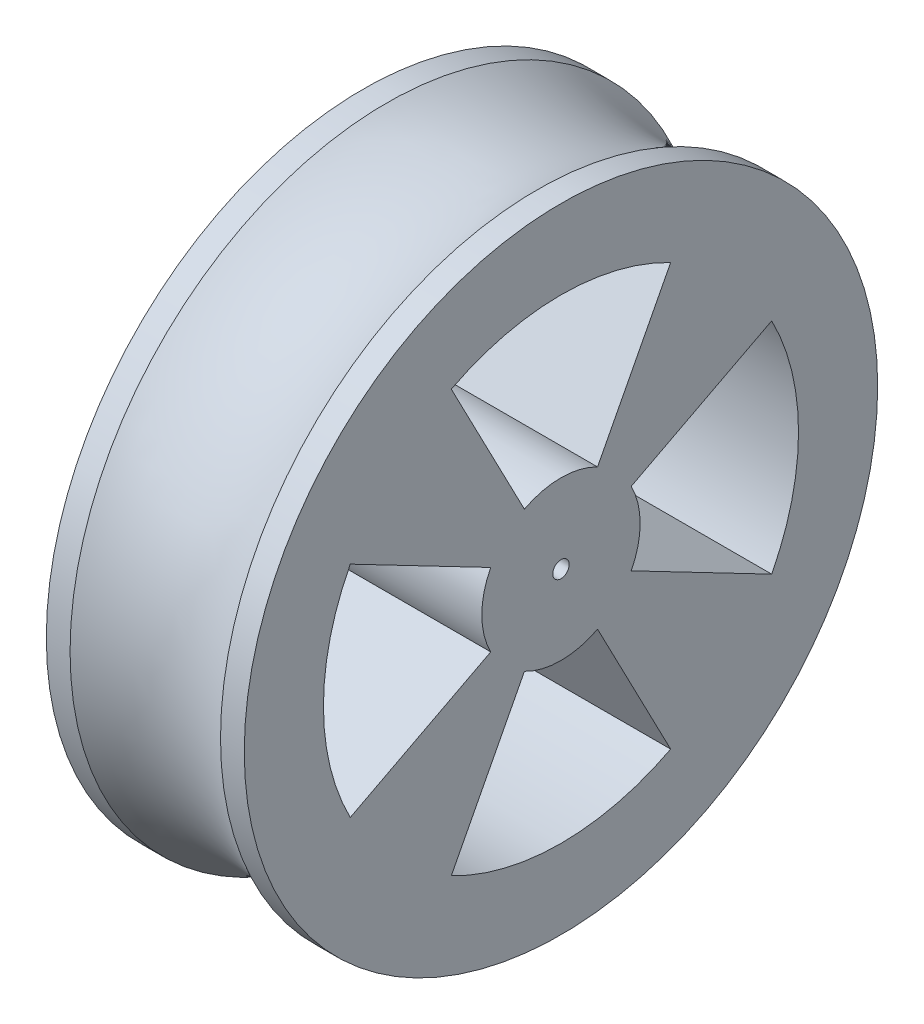
ISO-10303-21;
HEADER;
FILE_DESCRIPTION(('STEP AP214'),'2;1');
FILE_NAME('part.step','',(''),(''),'','','');
FILE_SCHEMA(('AUTOMOTIVE_DESIGN { 1 0 10303 214 1 1 1 1 }'));
ENDSEC;
DATA;
#1=APPLICATION_CONTEXT('core data for automotive mechanical design processes');
#2=APPLICATION_PROTOCOL_DEFINITION('international standard','automotive_design',2000,#1);
#3=PRODUCT_CONTEXT('',#1,'mechanical');
#4=PRODUCT('Part','Part','',(#3));
#5=PRODUCT_RELATED_PRODUCT_CATEGORY('part','',(#4));
#6=PRODUCT_DEFINITION_FORMATION('','',#4);
#7=PRODUCT_DEFINITION_CONTEXT('part definition',#1,'design');
#8=PRODUCT_DEFINITION('design','',#6,#7);
#9=PRODUCT_DEFINITION_SHAPE('','',#8);
#10=(LENGTH_UNIT() NAMED_UNIT(*) SI_UNIT(.MILLI.,.METRE.));
#11=(NAMED_UNIT(*) PLANE_ANGLE_UNIT() SI_UNIT($,.RADIAN.));
#12=(NAMED_UNIT(*) SI_UNIT($,.STERADIAN.) SOLID_ANGLE_UNIT());
#13=UNCERTAINTY_MEASURE_WITH_UNIT(LENGTH_MEASURE(1.E-05),#10,'distance_accuracy_value','');
#14=(GEOMETRIC_REPRESENTATION_CONTEXT(3) GLOBAL_UNCERTAINTY_ASSIGNED_CONTEXT((#13)) GLOBAL_UNIT_ASSIGNED_CONTEXT((#10,
#11,#12)) REPRESENTATION_CONTEXT('',''));
#15=CARTESIAN_POINT('',(0.,0.,0.));
#16=DIRECTION('',(0.,0.,1.));
#17=DIRECTION('',(1.,0.,0.));
#18=AXIS2_PLACEMENT_3D('',#15,#16,#17);
#19=CARTESIAN_POINT('',(12.5,0.,-40.));
#20=DIRECTION('',(-1.,0.,0.));
#21=DIRECTION('',(0.,0.,1.));
#22=AXIS2_PLACEMENT_3D('',#19,#20,#21);
#23=PLANE('',#22);
#24=CARTESIAN_POINT('',(12.5,0.,0.));
#25=DIRECTION('',(1.,0.,0.));
#26=DIRECTION('',(0.,0.,-1.));
#27=AXIS2_PLACEMENT_3D('',#24,#25,#26);
#28=CIRCLE('',#27,1.04);
#29=CARTESIAN_POINT('',(12.5,0.,-1.04));
#30=VERTEX_POINT('',#29);
#31=EDGE_CURVE('E165',#30,#30,#28,.T.);
#32=ORIENTED_EDGE('',*,*,#31,.F.);
#33=EDGE_LOOP('',(#32));
#34=FACE_BOUND('',#33,.T.);
#35=DIRECTION('',(0.,-0.887010833178223,0.461748613235032));
#36=VECTOR('',#35,1.);
#37=CARTESIAN_POINT('',(12.5,-26.6103249953467,13.8524583970509));
#38=LINE('',#37,#36);
#39=CARTESIAN_POINT('',(12.5,-8.87010833178223,4.61748613235032));
#40=VERTEX_POINT('',#39);
#41=CARTESIAN_POINT('',(12.5,-26.6103249953467,13.852458397051));
#42=VERTEX_POINT('',#41);
#43=EDGE_CURVE('E234',#40,#42,#38,.T.);
#44=ORIENTED_EDGE('',*,*,#43,.F.);
#45=CARTESIAN_POINT('',(12.5,0.,0.));
#46=DIRECTION('',(-1.,0.,0.));
#47=DIRECTION('',(0.,0.,-1.));
#48=AXIS2_PLACEMENT_3D('',#45,#46,#47);
#49=CIRCLE('',#48,10.);
#50=CARTESIAN_POINT('',(12.5,-8.87010833178223,-4.61748613235032));
#51=VERTEX_POINT('',#50);
#52=EDGE_CURVE('E54',#51,#40,#49,.T.);
#53=ORIENTED_EDGE('',*,*,#52,.F.);
#54=DIRECTION('',(0.,0.887010833178222,0.461748613235033));
#55=VECTOR('',#54,1.);
#56=CARTESIAN_POINT('',(12.5,-8.87010833178223,-4.61748613235032));
#57=LINE('',#56,#55);
#58=CARTESIAN_POINT('',(12.5,-26.6103249953467,-13.852458397051));
#59=VERTEX_POINT('',#58);
#60=EDGE_CURVE('E219',#59,#51,#57,.T.);
#61=ORIENTED_EDGE('',*,*,#60,.F.);
#62=CARTESIAN_POINT('',(12.5,0.,0.));
#63=DIRECTION('',(1.,0.,0.));
#64=DIRECTION('',(0.,0.,-1.));
#65=AXIS2_PLACEMENT_3D('',#62,#63,#64);
#66=CIRCLE('',#65,30.);
#67=EDGE_CURVE('E238',#42,#59,#66,.T.);
#68=ORIENTED_EDGE('',*,*,#67,.F.);
#69=EDGE_LOOP('',(#44,#53,#61,#68));
#70=FACE_BOUND('',#69,.T.);
#71=DIRECTION('',(0.,-0.461748613235032,-0.887010833178223));
#72=VECTOR('',#71,1.);
#73=CARTESIAN_POINT('',(12.5,-13.8524583970509,-26.6103249953467));
#74=LINE('',#73,#72);
#75=CARTESIAN_POINT('',(12.5,-4.61748613235031,-8.87010833178223));
#76=VERTEX_POINT('',#75);
#77=CARTESIAN_POINT('',(12.5,-13.852458397051,-26.6103249953467));
#78=VERTEX_POINT('',#77);
#79=EDGE_CURVE('E276',#76,#78,#74,.T.);
#80=ORIENTED_EDGE('',*,*,#79,.F.);
#81=CARTESIAN_POINT('',(12.5,0.,0.));
#82=DIRECTION('',(-1.,0.,0.));
#83=DIRECTION('',(0.,0.,-1.));
#84=AXIS2_PLACEMENT_3D('',#81,#82,#83);
#85=CIRCLE('',#84,10.);
#86=CARTESIAN_POINT('',(12.5,4.61748613235032,-8.87010833178223));
#87=VERTEX_POINT('',#86);
#88=EDGE_CURVE('E62',#87,#76,#85,.T.);
#89=ORIENTED_EDGE('',*,*,#88,.F.);
#90=DIRECTION('',(0.,-0.461748613235032,0.887010833178223));
#91=VECTOR('',#90,1.);
#92=CARTESIAN_POINT('',(12.5,4.61748613235032,-8.87010833178223));
#93=LINE('',#92,#91);
#94=CARTESIAN_POINT('',(12.5,13.852458397051,-26.6103249953467));
#95=VERTEX_POINT('',#94);
#96=EDGE_CURVE('E261',#95,#87,#93,.T.);
#97=ORIENTED_EDGE('',*,*,#96,.F.);
#98=CARTESIAN_POINT('',(12.5,0.,0.));
#99=DIRECTION('',(1.,0.,0.));
#100=DIRECTION('',(0.,0.,-1.));
#101=AXIS2_PLACEMENT_3D('',#98,#99,#100);
#102=CIRCLE('',#101,30.);
#103=EDGE_CURVE('E280',#78,#95,#102,.T.);
#104=ORIENTED_EDGE('',*,*,#103,.F.);
#105=EDGE_LOOP('',(#80,#89,#97,#104));
#106=FACE_BOUND('',#105,.T.);
#107=DIRECTION('',(0.,0.461748613235032,0.887010833178223));
#108=VECTOR('',#107,1.);
#109=CARTESIAN_POINT('',(12.5,13.8524583970509,26.6103249953467));
#110=LINE('',#109,#108);
#111=CARTESIAN_POINT('',(12.5,4.61748613235032,8.87010833178222));
#112=VERTEX_POINT('',#111);
#113=CARTESIAN_POINT('',(12.5,13.8524583970509,26.6103249953467));
#114=VERTEX_POINT('',#113);
#115=EDGE_CURVE('E169',#112,#114,#110,.T.);
#116=ORIENTED_EDGE('',*,*,#115,.F.);
#117=CARTESIAN_POINT('',(12.5,0.,0.));
#118=DIRECTION('',(-1.,0.,0.));
#119=DIRECTION('',(0.,0.,-1.));
#120=AXIS2_PLACEMENT_3D('',#117,#118,#119);
#121=CIRCLE('',#120,10.);
#122=CARTESIAN_POINT('',(12.5,-4.61748613235032,8.87010833178222));
#123=VERTEX_POINT('',#122);
#124=EDGE_CURVE('E164',#123,#112,#121,.T.);
#125=ORIENTED_EDGE('',*,*,#124,.F.);
#126=DIRECTION('',(0.,0.461748613235032,-0.887010833178223));
#127=VECTOR('',#126,1.);
#128=CARTESIAN_POINT('',(12.5,-4.61748613235032,8.87010833178222));
#129=LINE('',#128,#127);
#130=CARTESIAN_POINT('',(12.5,-13.852458397051,26.6103249953467));
#131=VERTEX_POINT('',#130);
#132=EDGE_CURVE('E179',#131,#123,#129,.T.);
#133=ORIENTED_EDGE('',*,*,#132,.F.);
#134=CARTESIAN_POINT('',(12.5,0.,0.));
#135=DIRECTION('',(1.,0.,0.));
#136=DIRECTION('',(0.,0.,-1.));
#137=AXIS2_PLACEMENT_3D('',#134,#135,#136);
#138=CIRCLE('',#137,30.);
#139=EDGE_CURVE('E195',#114,#131,#138,.T.);
#140=ORIENTED_EDGE('',*,*,#139,.F.);
#141=EDGE_LOOP('',(#116,#125,#133,#140));
#142=FACE_BOUND('',#141,.T.);
#143=DIRECTION('',(0.,0.887010833178223,-0.461748613235032));
#144=VECTOR('',#143,1.);
#145=CARTESIAN_POINT('',(12.5,26.6103249953467,-13.852458397051));
#146=LINE('',#145,#144);
#147=CARTESIAN_POINT('',(12.5,8.87010833178223,-4.61748613235032));
#148=VERTEX_POINT('',#147);
#149=CARTESIAN_POINT('',(12.5,26.6103249953467,-13.852458397051));
#150=VERTEX_POINT('',#149);
#151=EDGE_CURVE('E319',#148,#150,#146,.T.);
#152=ORIENTED_EDGE('',*,*,#151,.F.);
#153=CARTESIAN_POINT('',(12.5,0.,0.));
#154=DIRECTION('',(-1.,0.,0.));
#155=DIRECTION('',(0.,0.,-1.));
#156=AXIS2_PLACEMENT_3D('',#153,#154,#155);
#157=CIRCLE('',#156,10.);
#158=CARTESIAN_POINT('',(12.5,8.87010833178223,4.61748613235031));
#159=VERTEX_POINT('',#158);
#160=EDGE_CURVE('E290',#159,#148,#157,.T.);
#161=ORIENTED_EDGE('',*,*,#160,.F.);
#162=DIRECTION('',(0.,-0.887010833178223,-0.461748613235032));
#163=VECTOR('',#162,1.);
#164=CARTESIAN_POINT('',(12.5,8.87010833178223,4.61748613235031));
#165=LINE('',#164,#163);
#166=CARTESIAN_POINT('',(12.5,26.6103249953467,13.8524583970509));
#167=VERTEX_POINT('',#166);
#168=EDGE_CURVE('E304',#167,#159,#165,.T.);
#169=ORIENTED_EDGE('',*,*,#168,.F.);
#170=CARTESIAN_POINT('',(12.5,0.,0.));
#171=DIRECTION('',(1.,0.,0.));
#172=DIRECTION('',(0.,0.,-1.));
#173=AXIS2_PLACEMENT_3D('',#170,#171,#172);
#174=CIRCLE('',#173,30.);
#175=EDGE_CURVE('E323',#150,#167,#174,.T.);
#176=ORIENTED_EDGE('',*,*,#175,.F.);
#177=EDGE_LOOP('',(#152,#161,#169,#176));
#178=FACE_BOUND('',#177,.T.);
#179=CARTESIAN_POINT('',(12.5,0.,0.));
#180=DIRECTION('',(-1.,0.,0.));
#181=DIRECTION('',(0.,0.,1.));
#182=AXIS2_PLACEMENT_3D('',#179,#180,#181);
#183=CIRCLE('',#182,40.);
#184=CARTESIAN_POINT('',(12.5,0.,40.));
#185=VERTEX_POINT('',#184);
#186=EDGE_CURVE('E11',#185,#185,#183,.T.);
#187=ORIENTED_EDGE('',*,*,#186,.F.);
#188=EDGE_LOOP('',(#187));
#189=FACE_BOUND('',#188,.T.);
#190=ADVANCED_FACE('F39',(#34,#70,#106,#142,#178,#189),#23,.F.);
#191=CARTESIAN_POINT('',(-12.5,0.,0.));
#192=DIRECTION('',(-1.,0.,0.));
#193=DIRECTION('',(0.,0.,1.));
#194=AXIS2_PLACEMENT_3D('',#191,#192,#193);
#195=CYLINDRICAL_SURFACE('',#194,40.);
#196=CARTESIAN_POINT('',(9.49999999999999,0.,0.));
#197=DIRECTION('',(-1.,0.,0.));
#198=DIRECTION('',(0.,0.,1.));
#199=AXIS2_PLACEMENT_3D('',#196,#197,#198);
#200=CIRCLE('',#199,40.);
#201=CARTESIAN_POINT('',(9.5,0.,40.));
#202=VERTEX_POINT('',#201);
#203=EDGE_CURVE('E47',#202,#202,#200,.T.);
#204=ORIENTED_EDGE('',*,*,#203,.F.);
#205=EDGE_LOOP('',(#204));
#206=FACE_BOUND('',#205,.T.);
#207=ORIENTED_EDGE('',*,*,#186,.T.);
#208=EDGE_LOOP('',(#207));
#209=FACE_BOUND('',#208,.T.);
#210=ADVANCED_FACE('F355',(#206,#209),#195,.T.);
#211=CARTESIAN_POINT('',(0.,0.,0.));
#212=DIRECTION('',(-1.,0.,0.));
#213=DIRECTION('',(0.,0.,1.));
#214=AXIS2_PLACEMENT_3D('',#211,#212,#213);
#215=TOROIDAL_SURFACE('',#214,57.599715906798,20.);
#216=CARTESIAN_POINT('',(-9.49999999999999,0.,0.));
#217=DIRECTION('',(-1.,0.,0.));
#218=DIRECTION('',(0.,0.,1.));
#219=AXIS2_PLACEMENT_3D('',#216,#217,#218);
#220=CIRCLE('',#219,40.);
#221=CARTESIAN_POINT('',(-9.49999999999999,0.,40.));
#222=VERTEX_POINT('',#221);
#223=EDGE_CURVE('E346',#222,#222,#220,.T.);
#224=ORIENTED_EDGE('',*,*,#223,.F.);
#225=EDGE_LOOP('',(#224));
#226=FACE_BOUND('',#225,.T.);
#227=ORIENTED_EDGE('',*,*,#203,.T.);
#228=EDGE_LOOP('',(#227));
#229=FACE_BOUND('',#228,.T.);
#230=ADVANCED_FACE('F353',(#226,#229),#215,.F.);
#231=CARTESIAN_POINT('',(-12.5,0.,0.));
#232=DIRECTION('',(-1.,0.,0.));
#233=DIRECTION('',(0.,0.,1.));
#234=AXIS2_PLACEMENT_3D('',#231,#232,#233);
#235=CYLINDRICAL_SURFACE('',#234,40.);
#236=CARTESIAN_POINT('',(-12.5,0.,0.));
#237=DIRECTION('',(-1.,0.,0.));
#238=DIRECTION('',(0.,0.,1.));
#239=AXIS2_PLACEMENT_3D('',#236,#237,#238);
#240=CIRCLE('',#239,40.);
#241=CARTESIAN_POINT('',(-12.5,0.,40.));
#242=VERTEX_POINT('',#241);
#243=EDGE_CURVE('E333',#242,#242,#240,.T.);
#244=ORIENTED_EDGE('',*,*,#243,.F.);
#245=EDGE_LOOP('',(#244));
#246=FACE_BOUND('',#245,.T.);
#247=ORIENTED_EDGE('',*,*,#223,.T.);
#248=EDGE_LOOP('',(#247));
#249=FACE_BOUND('',#248,.T.);
#250=ADVANCED_FACE('F396',(#246,#249),#235,.T.);
#251=CARTESIAN_POINT('',(-12.5,0.,0.));
#252=DIRECTION('',(1.,0.,0.));
#253=DIRECTION('',(0.,0.,-1.));
#254=AXIS2_PLACEMENT_3D('',#251,#252,#253);
#255=PLANE('',#254);
#256=DIRECTION('',(0.,0.887010833178222,0.461748613235033));
#257=VECTOR('',#256,1.);
#258=CARTESIAN_POINT('',(-12.5,-8.87010833178223,-4.61748613235032));
#259=LINE('',#258,#257);
#260=CARTESIAN_POINT('',(-12.5,-26.6103249953467,-13.852458397051));
#261=VERTEX_POINT('',#260);
#262=CARTESIAN_POINT('',(-12.5,-8.87010833178223,-4.61748613235032));
#263=VERTEX_POINT('',#262);
#264=EDGE_CURVE('E227',#261,#263,#259,.T.);
#265=ORIENTED_EDGE('',*,*,#264,.T.);
#266=CARTESIAN_POINT('',(-12.5,0.,0.));
#267=DIRECTION('',(-1.,0.,0.));
#268=DIRECTION('',(0.,0.,-1.));
#269=AXIS2_PLACEMENT_3D('',#266,#267,#268);
#270=CIRCLE('',#269,10.);
#271=CARTESIAN_POINT('',(-12.5,-8.87010833178223,4.61748613235032));
#272=VERTEX_POINT('',#271);
#273=EDGE_CURVE('E214',#263,#272,#270,.T.);
#274=ORIENTED_EDGE('',*,*,#273,.T.);
#275=DIRECTION('',(0.,-0.887010833178223,0.461748613235032));
#276=VECTOR('',#275,1.);
#277=CARTESIAN_POINT('',(-12.5,-26.6103249953467,13.852458397051));
#278=LINE('',#277,#276);
#279=CARTESIAN_POINT('',(-12.5,-26.6103249953467,13.8524583970509));
#280=VERTEX_POINT('',#279);
#281=EDGE_CURVE('E218',#272,#280,#278,.T.);
#282=ORIENTED_EDGE('',*,*,#281,.T.);
#283=CARTESIAN_POINT('',(-12.5,0.,0.));
#284=DIRECTION('',(1.,0.,0.));
#285=DIRECTION('',(0.,0.,-1.));
#286=AXIS2_PLACEMENT_3D('',#283,#284,#285);
#287=CIRCLE('',#286,30.);
#288=EDGE_CURVE('E223',#280,#261,#287,.T.);
#289=ORIENTED_EDGE('',*,*,#288,.T.);
#290=EDGE_LOOP('',(#265,#274,#282,#289));
#291=FACE_BOUND('',#290,.T.);
#292=DIRECTION('',(0.,-0.461748613235032,0.887010833178223));
#293=VECTOR('',#292,1.);
#294=CARTESIAN_POINT('',(-12.5,4.61748613235032,-8.87010833178222));
#295=LINE('',#294,#293);
#296=CARTESIAN_POINT('',(-12.5,13.852458397051,-26.6103249953467));
#297=VERTEX_POINT('',#296);
#298=CARTESIAN_POINT('',(-12.5,4.61748613235032,-8.87010833178222));
#299=VERTEX_POINT('',#298);
#300=EDGE_CURVE('E269',#297,#299,#295,.T.);
#301=ORIENTED_EDGE('',*,*,#300,.T.);
#302=CARTESIAN_POINT('',(-12.5,0.,0.));
#303=DIRECTION('',(-1.,0.,0.));
#304=DIRECTION('',(0.,0.,-1.));
#305=AXIS2_PLACEMENT_3D('',#302,#303,#304);
#306=CIRCLE('',#305,10.);
#307=CARTESIAN_POINT('',(-12.5,-4.61748613235032,-8.87010833178222));
#308=VERTEX_POINT('',#307);
#309=EDGE_CURVE('E256',#299,#308,#306,.T.);
#310=ORIENTED_EDGE('',*,*,#309,.T.);
#311=DIRECTION('',(0.,-0.461748613235032,-0.887010833178223));
#312=VECTOR('',#311,1.);
#313=CARTESIAN_POINT('',(-12.5,-13.8524583970509,-26.6103249953467));
#314=LINE('',#313,#312);
#315=CARTESIAN_POINT('',(-12.5,-13.852458397051,-26.6103249953467));
#316=VERTEX_POINT('',#315);
#317=EDGE_CURVE('E260',#308,#316,#314,.T.);
#318=ORIENTED_EDGE('',*,*,#317,.T.);
#319=CARTESIAN_POINT('',(-12.5,0.,0.));
#320=DIRECTION('',(1.,0.,0.));
#321=DIRECTION('',(0.,0.,-1.));
#322=AXIS2_PLACEMENT_3D('',#319,#320,#321);
#323=CIRCLE('',#322,30.);
#324=EDGE_CURVE('E265',#316,#297,#323,.T.);
#325=ORIENTED_EDGE('',*,*,#324,.T.);
#326=EDGE_LOOP('',(#301,#310,#318,#325));
#327=FACE_BOUND('',#326,.T.);
#328=DIRECTION('',(0.,0.461748613235032,-0.887010833178223));
#329=VECTOR('',#328,1.);
#330=CARTESIAN_POINT('',(-12.5,-4.61748613235032,8.87010833178223));
#331=LINE('',#330,#329);
#332=CARTESIAN_POINT('',(-12.5,-13.852458397051,26.6103249953467));
#333=VERTEX_POINT('',#332);
#334=CARTESIAN_POINT('',(-12.5,-4.61748613235032,8.87010833178223));
#335=VERTEX_POINT('',#334);
#336=EDGE_CURVE('E187',#333,#335,#331,.T.);
#337=ORIENTED_EDGE('',*,*,#336,.T.);
#338=CARTESIAN_POINT('',(-12.5,0.,0.));
#339=DIRECTION('',(-1.,0.,0.));
#340=DIRECTION('',(0.,0.,-1.));
#341=AXIS2_PLACEMENT_3D('',#338,#339,#340);
#342=CIRCLE('',#341,10.);
#343=CARTESIAN_POINT('',(-12.5,4.61748613235031,8.87010833178223));
#344=VERTEX_POINT('',#343);
#345=EDGE_CURVE('E174',#335,#344,#342,.T.);
#346=ORIENTED_EDGE('',*,*,#345,.T.);
#347=DIRECTION('',(0.,0.461748613235032,0.887010833178223));
#348=VECTOR('',#347,1.);
#349=CARTESIAN_POINT('',(-12.5,13.8524583970509,26.6103249953467));
#350=LINE('',#349,#348);
#351=CARTESIAN_POINT('',(-12.5,13.8524583970509,26.6103249953467));
#352=VERTEX_POINT('',#351);
#353=EDGE_CURVE('E178',#344,#352,#350,.T.);
#354=ORIENTED_EDGE('',*,*,#353,.T.);
#355=CARTESIAN_POINT('',(-12.5,0.,0.));
#356=DIRECTION('',(1.,0.,0.));
#357=DIRECTION('',(0.,0.,-1.));
#358=AXIS2_PLACEMENT_3D('',#355,#356,#357);
#359=CIRCLE('',#358,30.);
#360=EDGE_CURVE('E183',#352,#333,#359,.T.);
#361=ORIENTED_EDGE('',*,*,#360,.T.);
#362=EDGE_LOOP('',(#337,#346,#354,#361));
#363=FACE_BOUND('',#362,.T.);
#364=DIRECTION('',(0.,-0.887010833178223,-0.461748613235032));
#365=VECTOR('',#364,1.);
#366=CARTESIAN_POINT('',(-12.5,8.87010833178223,4.61748613235032));
#367=LINE('',#366,#365);
#368=CARTESIAN_POINT('',(-12.5,26.6103249953467,13.852458397051));
#369=VERTEX_POINT('',#368);
#370=CARTESIAN_POINT('',(-12.5,8.87010833178223,4.61748613235032));
#371=VERTEX_POINT('',#370);
#372=EDGE_CURVE('E312',#369,#371,#367,.T.);
#373=ORIENTED_EDGE('',*,*,#372,.T.);
#374=CARTESIAN_POINT('',(-12.5,0.,0.));
#375=DIRECTION('',(-1.,0.,0.));
#376=DIRECTION('',(0.,0.,-1.));
#377=AXIS2_PLACEMENT_3D('',#374,#375,#376);
#378=CIRCLE('',#377,10.);
#379=CARTESIAN_POINT('',(-12.5,8.87010833178223,-4.61748613235031));
#380=VERTEX_POINT('',#379);
#381=EDGE_CURVE('E299',#371,#380,#378,.T.);
#382=ORIENTED_EDGE('',*,*,#381,.T.);
#383=DIRECTION('',(0.,0.887010833178223,-0.461748613235032));
#384=VECTOR('',#383,1.);
#385=CARTESIAN_POINT('',(-12.5,26.6103249953467,-13.8524583970509));
#386=LINE('',#385,#384);
#387=CARTESIAN_POINT('',(-12.5,26.6103249953467,-13.852458397051));
#388=VERTEX_POINT('',#387);
#389=EDGE_CURVE('E303',#380,#388,#386,.T.);
#390=ORIENTED_EDGE('',*,*,#389,.T.);
#391=CARTESIAN_POINT('',(-12.5,0.,0.));
#392=DIRECTION('',(1.,0.,0.));
#393=DIRECTION('',(0.,0.,-1.));
#394=AXIS2_PLACEMENT_3D('',#391,#392,#393);
#395=CIRCLE('',#394,30.);
#396=EDGE_CURVE('E308',#388,#369,#395,.T.);
#397=ORIENTED_EDGE('',*,*,#396,.T.);
#398=EDGE_LOOP('',(#373,#382,#390,#397));
#399=FACE_BOUND('',#398,.T.);
#400=ORIENTED_EDGE('',*,*,#243,.T.);
#401=EDGE_LOOP('',(#400));
#402=FACE_BOUND('',#401,.T.);
#403=ADVANCED_FACE('F393',(#291,#327,#363,#399,#402),#255,.F.);
#404=CARTESIAN_POINT('',(-12.5,0.,0.));
#405=DIRECTION('',(1.,0.,0.));
#406=DIRECTION('',(0.,0.,-1.));
#407=AXIS2_PLACEMENT_3D('',#404,#405,#406);
#408=CYLINDRICAL_SURFACE('',#407,10.);
#409=ORIENTED_EDGE('',*,*,#160,.T.);
#410=DIRECTION('',(1.,0.,0.));
#411=VECTOR('',#410,1.);
#412=CARTESIAN_POINT('',(-12.5,8.87010833178223,-4.61748613235031));
#413=LINE('',#412,#411);
#414=EDGE_CURVE('E316',#380,#148,#413,.T.);
#415=ORIENTED_EDGE('',*,*,#414,.F.);
#416=ORIENTED_EDGE('',*,*,#381,.F.);
#417=DIRECTION('',(1.,0.,0.));
#418=VECTOR('',#417,1.);
#419=CARTESIAN_POINT('',(-12.5,8.87010833178223,4.61748613235032));
#420=LINE('',#419,#418);
#421=EDGE_CURVE('E330',#371,#159,#420,.T.);
#422=ORIENTED_EDGE('',*,*,#421,.T.);
#423=EDGE_LOOP('',(#409,#415,#416,#422));
#424=FACE_BOUND('',#423,.T.);
#425=ADVANCED_FACE('F386',(#424),#408,.T.);
#426=CARTESIAN_POINT('',(-12.5,8.87010833178223,4.61748613235032));
#427=DIRECTION('',(0.,-0.461748613235032,0.887010833178223));
#428=DIRECTION('',(0.,-0.887010833178223,-0.461748613235032));
#429=AXIS2_PLACEMENT_3D('',#426,#427,#428);
#430=PLANE('',#429);
#431=ORIENTED_EDGE('',*,*,#168,.T.);
#432=ORIENTED_EDGE('',*,*,#421,.F.);
#433=ORIENTED_EDGE('',*,*,#372,.F.);
#434=DIRECTION('',(1.,0.,0.));
#435=VECTOR('',#434,1.);
#436=CARTESIAN_POINT('',(-12.5,26.6103249953467,13.852458397051));
#437=LINE('',#436,#435);
#438=EDGE_CURVE('E334',#369,#167,#437,.T.);
#439=ORIENTED_EDGE('',*,*,#438,.T.);
#440=EDGE_LOOP('',(#431,#432,#433,#439));
#441=FACE_BOUND('',#440,.T.);
#442=ADVANCED_FACE('F389',(#441),#430,.F.);
#443=CARTESIAN_POINT('',(-12.5,0.,0.));
#444=DIRECTION('',(1.,0.,0.));
#445=DIRECTION('',(0.,0.,-1.));
#446=AXIS2_PLACEMENT_3D('',#443,#444,#445);
#447=CYLINDRICAL_SURFACE('',#446,30.);
#448=ORIENTED_EDGE('',*,*,#175,.T.);
#449=ORIENTED_EDGE('',*,*,#438,.F.);
#450=ORIENTED_EDGE('',*,*,#396,.F.);
#451=DIRECTION('',(1.,0.,0.));
#452=VECTOR('',#451,1.);
#453=CARTESIAN_POINT('',(-12.5,26.6103249953467,-13.8524583970509));
#454=LINE('',#453,#452);
#455=EDGE_CURVE('E337',#388,#150,#454,.T.);
#456=ORIENTED_EDGE('',*,*,#455,.T.);
#457=EDGE_LOOP('',(#448,#449,#450,#456));
#458=FACE_BOUND('',#457,.T.);
#459=ADVANCED_FACE('F391',(#458),#447,.F.);
#460=CARTESIAN_POINT('',(-12.5,26.6103249953467,-13.8524583970509));
#461=DIRECTION('',(0.,-0.461748613235032,-0.887010833178223));
#462=DIRECTION('',(0.,0.887010833178223,-0.461748613235032));
#463=AXIS2_PLACEMENT_3D('',#460,#461,#462);
#464=PLANE('',#463);
#465=ORIENTED_EDGE('',*,*,#151,.T.);
#466=ORIENTED_EDGE('',*,*,#455,.F.);
#467=ORIENTED_EDGE('',*,*,#389,.F.);
#468=ORIENTED_EDGE('',*,*,#414,.T.);
#469=EDGE_LOOP('',(#465,#466,#467,#468));
#470=FACE_BOUND('',#469,.T.);
#471=ADVANCED_FACE('F382',(#470),#464,.F.);
#472=CARTESIAN_POINT('',(-12.5,0.,0.));
#473=DIRECTION('',(1.,0.,0.));
#474=DIRECTION('',(0.,0.,-1.));
#475=AXIS2_PLACEMENT_3D('',#472,#473,#474);
#476=CYLINDRICAL_SURFACE('',#475,10.);
#477=ORIENTED_EDGE('',*,*,#124,.T.);
#478=DIRECTION('',(1.,0.,0.));
#479=VECTOR('',#478,1.);
#480=CARTESIAN_POINT('',(-12.5,4.61748613235031,8.87010833178223));
#481=LINE('',#480,#479);
#482=EDGE_CURVE('E190',#344,#112,#481,.T.);
#483=ORIENTED_EDGE('',*,*,#482,.F.);
#484=ORIENTED_EDGE('',*,*,#345,.F.);
#485=DIRECTION('',(1.,0.,0.));
#486=VECTOR('',#485,1.);
#487=CARTESIAN_POINT('',(-12.5,-4.61748613235032,8.87010833178223));
#488=LINE('',#487,#486);
#489=EDGE_CURVE('E202',#335,#123,#488,.T.);
#490=ORIENTED_EDGE('',*,*,#489,.T.);
#491=EDGE_LOOP('',(#477,#483,#484,#490));
#492=FACE_BOUND('',#491,.T.);
#493=ADVANCED_FACE('F415',(#492),#476,.T.);
#494=CARTESIAN_POINT('',(-12.5,-4.61748613235032,8.87010833178223));
#495=DIRECTION('',(0.,-0.887010833178223,-0.461748613235032));
#496=DIRECTION('',(0.,0.461748613235032,-0.887010833178223));
#497=AXIS2_PLACEMENT_3D('',#494,#495,#496);
#498=PLANE('',#497);
#499=ORIENTED_EDGE('',*,*,#132,.T.);
#500=ORIENTED_EDGE('',*,*,#489,.F.);
#501=ORIENTED_EDGE('',*,*,#336,.F.);
#502=DIRECTION('',(1.,0.,0.));
#503=VECTOR('',#502,1.);
#504=CARTESIAN_POINT('',(-12.5,-13.852458397051,26.6103249953467));
#505=LINE('',#504,#503);
#506=EDGE_CURVE('E205',#333,#131,#505,.T.);
#507=ORIENTED_EDGE('',*,*,#506,.T.);
#508=EDGE_LOOP('',(#499,#500,#501,#507));
#509=FACE_BOUND('',#508,.T.);
#510=ADVANCED_FACE('F452',(#509),#498,.F.);
#511=CARTESIAN_POINT('',(-12.5,0.,0.));
#512=DIRECTION('',(1.,0.,0.));
#513=DIRECTION('',(0.,0.,-1.));
#514=AXIS2_PLACEMENT_3D('',#511,#512,#513);
#515=CYLINDRICAL_SURFACE('',#514,30.);
#516=ORIENTED_EDGE('',*,*,#139,.T.);
#517=ORIENTED_EDGE('',*,*,#506,.F.);
#518=ORIENTED_EDGE('',*,*,#360,.F.);
#519=DIRECTION('',(1.,0.,0.));
#520=VECTOR('',#519,1.);
#521=CARTESIAN_POINT('',(-12.5,13.8524583970509,26.6103249953467));
#522=LINE('',#521,#520);
#523=EDGE_CURVE('E208',#352,#114,#522,.T.);
#524=ORIENTED_EDGE('',*,*,#523,.T.);
#525=EDGE_LOOP('',(#516,#517,#518,#524));
#526=FACE_BOUND('',#525,.T.);
#527=ADVANCED_FACE('F456',(#526),#515,.F.);
#528=CARTESIAN_POINT('',(-12.5,13.8524583970509,26.6103249953467));
#529=DIRECTION('',(0.,0.887010833178223,-0.461748613235032));
#530=DIRECTION('',(0.,0.461748613235032,0.887010833178223));
#531=AXIS2_PLACEMENT_3D('',#528,#529,#530);
#532=PLANE('',#531);
#533=ORIENTED_EDGE('',*,*,#115,.T.);
#534=ORIENTED_EDGE('',*,*,#523,.F.);
#535=ORIENTED_EDGE('',*,*,#353,.F.);
#536=ORIENTED_EDGE('',*,*,#482,.T.);
#537=EDGE_LOOP('',(#533,#534,#535,#536));
#538=FACE_BOUND('',#537,.T.);
#539=ADVANCED_FACE('F424',(#538),#532,.F.);
#540=CARTESIAN_POINT('',(-12.5,0.,0.));
#541=DIRECTION('',(1.,0.,0.));
#542=DIRECTION('',(0.,0.,-1.));
#543=AXIS2_PLACEMENT_3D('',#540,#541,#542);
#544=CYLINDRICAL_SURFACE('',#543,10.);
#545=ORIENTED_EDGE('',*,*,#88,.T.);
#546=DIRECTION('',(1.,0.,0.));
#547=VECTOR('',#546,1.);
#548=CARTESIAN_POINT('',(-12.5,-4.61748613235032,-8.87010833178222));
#549=LINE('',#548,#547);
#550=EDGE_CURVE('E273',#308,#76,#549,.T.);
#551=ORIENTED_EDGE('',*,*,#550,.F.);
#552=ORIENTED_EDGE('',*,*,#309,.F.);
#553=DIRECTION('',(1.,0.,0.));
#554=VECTOR('',#553,1.);
#555=CARTESIAN_POINT('',(-12.5,4.61748613235032,-8.87010833178222));
#556=LINE('',#555,#554);
#557=EDGE_CURVE('E287',#299,#87,#556,.T.);
#558=ORIENTED_EDGE('',*,*,#557,.T.);
#559=EDGE_LOOP('',(#545,#551,#552,#558));
#560=FACE_BOUND('',#559,.T.);
#561=ADVANCED_FACE('F420',(#560),#544,.T.);
#562=CARTESIAN_POINT('',(-12.5,4.61748613235032,-8.87010833178222));
#563=DIRECTION('',(0.,0.887010833178223,0.461748613235032));
#564=DIRECTION('',(0.,-0.461748613235032,0.887010833178223));
#565=AXIS2_PLACEMENT_3D('',#562,#563,#564);
#566=PLANE('',#565);
#567=ORIENTED_EDGE('',*,*,#96,.T.);
#568=ORIENTED_EDGE('',*,*,#557,.F.);
#569=ORIENTED_EDGE('',*,*,#300,.F.);
#570=DIRECTION('',(1.,0.,0.));
#571=VECTOR('',#570,1.);
#572=CARTESIAN_POINT('',(-12.5,13.852458397051,-26.6103249953467));
#573=LINE('',#572,#571);
#574=EDGE_CURVE('E291',#297,#95,#573,.T.);
#575=ORIENTED_EDGE('',*,*,#574,.T.);
#576=EDGE_LOOP('',(#567,#568,#569,#575));
#577=FACE_BOUND('',#576,.T.);
#578=ADVANCED_FACE('F423',(#577),#566,.F.);
#579=CARTESIAN_POINT('',(-12.5,0.,0.));
#580=DIRECTION('',(1.,0.,0.));
#581=DIRECTION('',(0.,0.,-1.));
#582=AXIS2_PLACEMENT_3D('',#579,#580,#581);
#583=CYLINDRICAL_SURFACE('',#582,30.);
#584=ORIENTED_EDGE('',*,*,#103,.T.);
#585=ORIENTED_EDGE('',*,*,#574,.F.);
#586=ORIENTED_EDGE('',*,*,#324,.F.);
#587=DIRECTION('',(1.,0.,0.));
#588=VECTOR('',#587,1.);
#589=CARTESIAN_POINT('',(-12.5,-13.852458397051,-26.6103249953467));
#590=LINE('',#589,#588);
#591=EDGE_CURVE('E294',#316,#78,#590,.T.);
#592=ORIENTED_EDGE('',*,*,#591,.T.);
#593=EDGE_LOOP('',(#584,#585,#586,#592));
#594=FACE_BOUND('',#593,.T.);
#595=ADVANCED_FACE('F429',(#594),#583,.F.);
#596=CARTESIAN_POINT('',(-12.5,-13.8524583970509,-26.6103249953467));
#597=DIRECTION('',(0.,-0.887010833178223,0.461748613235032));
#598=DIRECTION('',(0.,-0.461748613235032,-0.887010833178223));
#599=AXIS2_PLACEMENT_3D('',#596,#597,#598);
#600=PLANE('',#599);
#601=ORIENTED_EDGE('',*,*,#79,.T.);
#602=ORIENTED_EDGE('',*,*,#591,.F.);
#603=ORIENTED_EDGE('',*,*,#317,.F.);
#604=ORIENTED_EDGE('',*,*,#550,.T.);
#605=EDGE_LOOP('',(#601,#602,#603,#604));
#606=FACE_BOUND('',#605,.T.);
#607=ADVANCED_FACE('F425',(#606),#600,.F.);
#608=CARTESIAN_POINT('',(-12.5,0.,0.));
#609=DIRECTION('',(1.,0.,0.));
#610=DIRECTION('',(0.,0.,-1.));
#611=AXIS2_PLACEMENT_3D('',#608,#609,#610);
#612=CYLINDRICAL_SURFACE('',#611,10.);
#613=ORIENTED_EDGE('',*,*,#52,.T.);
#614=DIRECTION('',(1.,0.,0.));
#615=VECTOR('',#614,1.);
#616=CARTESIAN_POINT('',(-12.5,-8.87010833178223,4.61748613235032));
#617=LINE('',#616,#615);
#618=EDGE_CURVE('E231',#272,#40,#617,.T.);
#619=ORIENTED_EDGE('',*,*,#618,.F.);
#620=ORIENTED_EDGE('',*,*,#273,.F.);
#621=DIRECTION('',(1.,0.,0.));
#622=VECTOR('',#621,1.);
#623=CARTESIAN_POINT('',(-12.5,-8.87010833178223,-4.61748613235032));
#624=LINE('',#623,#622);
#625=EDGE_CURVE('E245',#263,#51,#624,.T.);
#626=ORIENTED_EDGE('',*,*,#625,.T.);
#627=EDGE_LOOP('',(#613,#619,#620,#626));
#628=FACE_BOUND('',#627,.T.);
#629=ADVANCED_FACE('F428',(#628),#612,.T.);
#630=CARTESIAN_POINT('',(-12.5,-8.87010833178223,-4.61748613235032));
#631=DIRECTION('',(0.,0.461748613235033,-0.887010833178222));
#632=DIRECTION('',(0.,0.887010833178222,0.461748613235033));
#633=AXIS2_PLACEMENT_3D('',#630,#631,#632);
#634=PLANE('',#633);
#635=ORIENTED_EDGE('',*,*,#60,.T.);
#636=ORIENTED_EDGE('',*,*,#625,.F.);
#637=ORIENTED_EDGE('',*,*,#264,.F.);
#638=DIRECTION('',(1.,0.,0.));
#639=VECTOR('',#638,1.);
#640=CARTESIAN_POINT('',(-12.5,-26.6103249953467,-13.852458397051));
#641=LINE('',#640,#639);
#642=EDGE_CURVE('E248',#261,#59,#641,.T.);
#643=ORIENTED_EDGE('',*,*,#642,.T.);
#644=EDGE_LOOP('',(#635,#636,#637,#643));
#645=FACE_BOUND('',#644,.T.);
#646=ADVANCED_FACE('F439',(#645),#634,.F.);
#647=CARTESIAN_POINT('',(-12.5,0.,0.));
#648=DIRECTION('',(1.,0.,0.));
#649=DIRECTION('',(0.,0.,-1.));
#650=AXIS2_PLACEMENT_3D('',#647,#648,#649);
#651=CYLINDRICAL_SURFACE('',#650,30.);
#652=ORIENTED_EDGE('',*,*,#67,.T.);
#653=ORIENTED_EDGE('',*,*,#642,.F.);
#654=ORIENTED_EDGE('',*,*,#288,.F.);
#655=DIRECTION('',(1.,0.,0.));
#656=VECTOR('',#655,1.);
#657=CARTESIAN_POINT('',(-12.5,-26.6103249953467,13.852458397051));
#658=LINE('',#657,#656);
#659=EDGE_CURVE('E251',#280,#42,#658,.T.);
#660=ORIENTED_EDGE('',*,*,#659,.T.);
#661=EDGE_LOOP('',(#652,#653,#654,#660));
#662=FACE_BOUND('',#661,.T.);
#663=ADVANCED_FACE('F442',(#662),#651,.F.);
#664=CARTESIAN_POINT('',(-12.5,-26.6103249953467,13.852458397051));
#665=DIRECTION('',(0.,0.461748613235032,0.887010833178223));
#666=DIRECTION('',(0.,-0.887010833178223,0.461748613235032));
#667=AXIS2_PLACEMENT_3D('',#664,#665,#666);
#668=PLANE('',#667);
#669=ORIENTED_EDGE('',*,*,#43,.T.);
#670=ORIENTED_EDGE('',*,*,#659,.F.);
#671=ORIENTED_EDGE('',*,*,#281,.F.);
#672=ORIENTED_EDGE('',*,*,#618,.T.);
#673=EDGE_LOOP('',(#669,#670,#671,#672));
#674=FACE_BOUND('',#673,.T.);
#675=ADVANCED_FACE('F157',(#674),#668,.F.);
#676=CARTESIAN_POINT('',(-7.5,0.,0.));
#677=DIRECTION('',(1.,0.,0.));
#678=DIRECTION('',(0.,0.,-1.));
#679=AXIS2_PLACEMENT_3D('',#676,#677,#678);
#680=CONICAL_SURFACE('',#679,1.04,1.02974425867665);
#681=CARTESIAN_POINT('',(-8.12489504378867,0.,0.));
#682=VERTEX_POINT('',#681);
#683=VERTEX_LOOP('',#682);
#684=FACE_BOUND('',#683,.T.);
#685=CARTESIAN_POINT('',(-7.5,0.,0.));
#686=DIRECTION('',(1.,0.,0.));
#687=DIRECTION('',(0.,0.,-1.));
#688=AXIS2_PLACEMENT_3D('',#685,#686,#687);
#689=CIRCLE('',#688,1.04);
#690=CARTESIAN_POINT('',(-7.5,0.,-1.03999999999999));
#691=VERTEX_POINT('',#690);
#692=EDGE_CURVE('E161',#691,#691,#689,.T.);
#693=ORIENTED_EDGE('',*,*,#692,.T.);
#694=EDGE_LOOP('',(#693));
#695=FACE_BOUND('',#694,.T.);
#696=ADVANCED_FACE('F153',(#684,#695),#680,.F.);
#697=CARTESIAN_POINT('',(12.5,0.,0.));
#698=DIRECTION('',(1.,0.,0.));
#699=DIRECTION('',(0.,0.,-1.));
#700=AXIS2_PLACEMENT_3D('',#697,#698,#699);
#701=CYLINDRICAL_SURFACE('',#700,1.04);
#702=ORIENTED_EDGE('',*,*,#692,.F.);
#703=EDGE_LOOP('',(#702));
#704=FACE_BOUND('',#703,.T.);
#705=ORIENTED_EDGE('',*,*,#31,.T.);
#706=EDGE_LOOP('',(#705));
#707=FACE_BOUND('',#706,.T.);
#708=ADVANCED_FACE('F156',(#704,#707),#701,.F.);
#709=CLOSED_SHELL('',(#190,#210,#230,#250,#403,#425,#442,#459,#471,#493,#510,#527,#539,#561,
#578,#595,#607,#629,#646,#663,#675,#696,#708));
#710=MANIFOLD_SOLID_BREP('B2',#709);
#711=ADVANCED_BREP_SHAPE_REPRESENTATION('',(#18,#710),#14);
#712=SHAPE_DEFINITION_REPRESENTATION(#9,#711);
ENDSEC;
END-ISO-10303-21;
